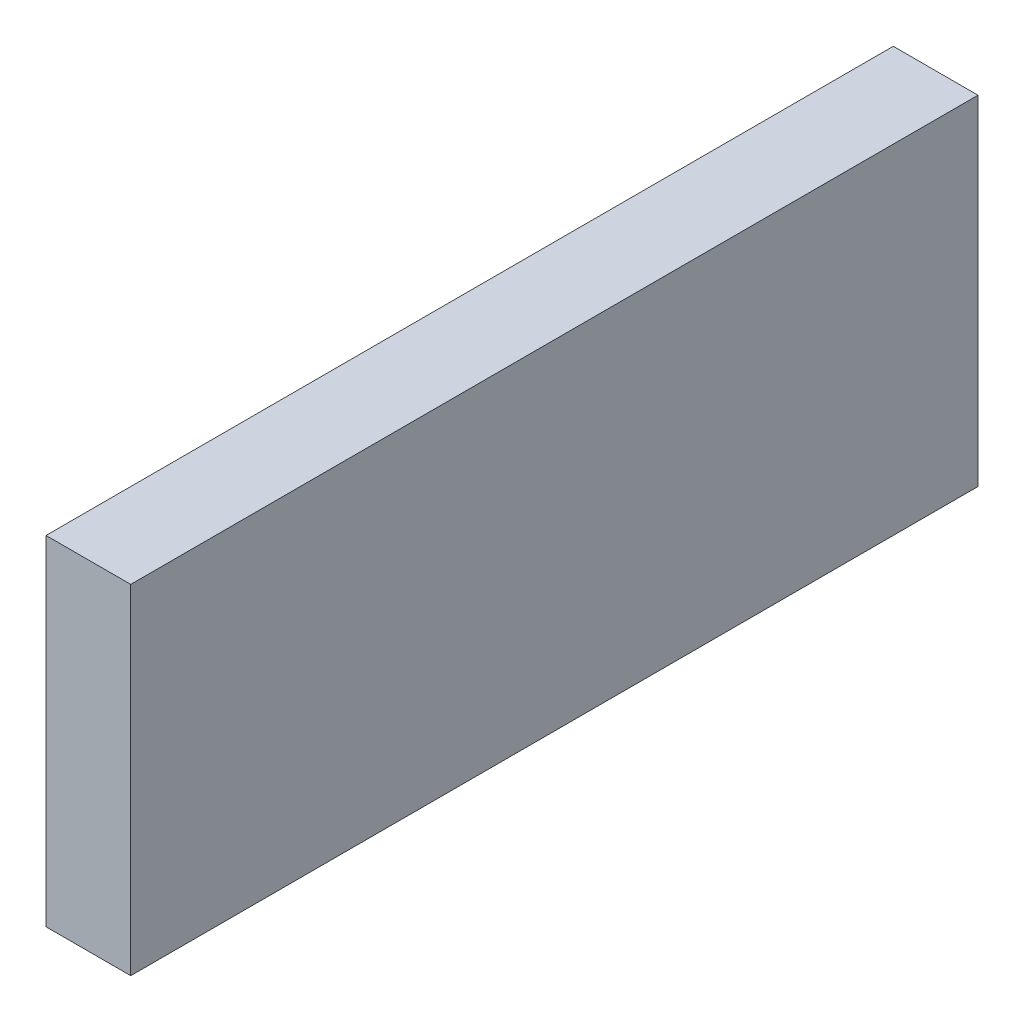
ISO-10303-21;
HEADER;
FILE_DESCRIPTION(('STEP AP214'),'2;1');
FILE_NAME('part.step','',(''),(''),'','','');
FILE_SCHEMA(('AUTOMOTIVE_DESIGN { 1 0 10303 214 1 1 1 1 }'));
ENDSEC;
DATA;
#1=APPLICATION_CONTEXT('core data for automotive mechanical design processes');
#2=APPLICATION_PROTOCOL_DEFINITION('international standard','automotive_design',2000,#1);
#3=PRODUCT_CONTEXT('',#1,'mechanical');
#4=PRODUCT('Part','Part','',(#3));
#5=PRODUCT_RELATED_PRODUCT_CATEGORY('part','',(#4));
#6=PRODUCT_DEFINITION_FORMATION('','',#4);
#7=PRODUCT_DEFINITION_CONTEXT('part definition',#1,'design');
#8=PRODUCT_DEFINITION('design','',#6,#7);
#9=PRODUCT_DEFINITION_SHAPE('','',#8);
#10=(LENGTH_UNIT() NAMED_UNIT(*) SI_UNIT(.MILLI.,.METRE.));
#11=(NAMED_UNIT(*) PLANE_ANGLE_UNIT() SI_UNIT($,.RADIAN.));
#12=(NAMED_UNIT(*) SI_UNIT($,.STERADIAN.) SOLID_ANGLE_UNIT());
#13=UNCERTAINTY_MEASURE_WITH_UNIT(LENGTH_MEASURE(1.E-05),#10,'distance_accuracy_value','');
#14=(GEOMETRIC_REPRESENTATION_CONTEXT(3) GLOBAL_UNCERTAINTY_ASSIGNED_CONTEXT((#13)) GLOBAL_UNIT_ASSIGNED_CONTEXT((#10,
#11,#12)) REPRESENTATION_CONTEXT('',''));
#15=CARTESIAN_POINT('',(0.,0.,0.));
#16=DIRECTION('',(0.,0.,1.));
#17=DIRECTION('',(1.,0.,0.));
#18=AXIS2_PLACEMENT_3D('',#15,#16,#17);
#19=CARTESIAN_POINT('',(0.,38.1,0.));
#20=DIRECTION('',(1.,0.,0.));
#21=DIRECTION('',(0.,0.,-1.));
#22=AXIS2_PLACEMENT_3D('',#19,#20,#21);
#23=PLANE('',#22);
#24=DIRECTION('',(0.,0.,1.));
#25=VECTOR('',#24,1.);
#26=CARTESIAN_POINT('',(0.,0.,0.));
#27=LINE('',#26,#25);
#28=CARTESIAN_POINT('',(0.,0.,-95.25));
#29=VERTEX_POINT('',#28);
#30=CARTESIAN_POINT('',(0.,0.,0.));
#31=VERTEX_POINT('',#30);
#32=EDGE_CURVE('E95',#29,#31,#27,.T.);
#33=ORIENTED_EDGE('',*,*,#32,.T.);
#34=DIRECTION('',(0.,-1.,0.));
#35=VECTOR('',#34,1.);
#36=CARTESIAN_POINT('',(0.,38.1,0.));
#37=LINE('',#36,#35);
#38=CARTESIAN_POINT('',(0.,38.1,0.));
#39=VERTEX_POINT('',#38);
#40=EDGE_CURVE('E11',#39,#31,#37,.T.);
#41=ORIENTED_EDGE('',*,*,#40,.F.);
#42=DIRECTION('',(0.,0.,1.));
#43=VECTOR('',#42,1.);
#44=CARTESIAN_POINT('',(0.,38.1,0.));
#45=LINE('',#44,#43);
#46=CARTESIAN_POINT('',(0.,38.1,-95.25));
#47=VERTEX_POINT('',#46);
#48=EDGE_CURVE('E83',#47,#39,#45,.T.);
#49=ORIENTED_EDGE('',*,*,#48,.F.);
#50=DIRECTION('',(0.,-1.,0.));
#51=VECTOR('',#50,1.);
#52=CARTESIAN_POINT('',(0.,38.1,-95.25));
#53=LINE('',#52,#51);
#54=EDGE_CURVE('E91',#47,#29,#53,.T.);
#55=ORIENTED_EDGE('',*,*,#54,.T.);
#56=EDGE_LOOP('',(#33,#41,#49,#55));
#57=FACE_BOUND('',#56,.T.);
#58=ADVANCED_FACE('F32',(#57),#23,.F.);
#59=CARTESIAN_POINT('',(0.,38.1,0.));
#60=DIRECTION('',(0.,0.,-1.));
#61=DIRECTION('',(-1.,0.,0.));
#62=AXIS2_PLACEMENT_3D('',#59,#60,#61);
#63=PLANE('',#62);
#64=DIRECTION('',(1.,0.,0.));
#65=VECTOR('',#64,1.);
#66=CARTESIAN_POINT('',(0.,0.,0.));
#67=LINE('',#66,#65);
#68=CARTESIAN_POINT('',(9.525,0.,0.));
#69=VERTEX_POINT('',#68);
#70=EDGE_CURVE('E87',#31,#69,#67,.T.);
#71=ORIENTED_EDGE('',*,*,#70,.T.);
#72=DIRECTION('',(0.,-1.,0.));
#73=VECTOR('',#72,1.);
#74=CARTESIAN_POINT('',(9.525,38.1,0.));
#75=LINE('',#74,#73);
#76=CARTESIAN_POINT('',(9.525,38.1,0.));
#77=VERTEX_POINT('',#76);
#78=EDGE_CURVE('E40',#77,#69,#75,.T.);
#79=ORIENTED_EDGE('',*,*,#78,.F.);
#80=DIRECTION('',(1.,0.,0.));
#81=VECTOR('',#80,1.);
#82=CARTESIAN_POINT('',(0.,38.1,0.));
#83=LINE('',#82,#81);
#84=EDGE_CURVE('E78',#39,#77,#83,.T.);
#85=ORIENTED_EDGE('',*,*,#84,.F.);
#86=ORIENTED_EDGE('',*,*,#40,.T.);
#87=EDGE_LOOP('',(#71,#79,#85,#86));
#88=FACE_BOUND('',#87,.T.);
#89=ADVANCED_FACE('F86',(#88),#63,.F.);
#90=CARTESIAN_POINT('',(9.525,38.1,0.));
#91=DIRECTION('',(-1.,0.,0.));
#92=DIRECTION('',(0.,0.,1.));
#93=AXIS2_PLACEMENT_3D('',#90,#91,#92);
#94=PLANE('',#93);
#95=DIRECTION('',(0.,0.,-1.));
#96=VECTOR('',#95,1.);
#97=CARTESIAN_POINT('',(9.525,0.,0.));
#98=LINE('',#97,#96);
#99=CARTESIAN_POINT('',(9.525,0.,-95.25));
#100=VERTEX_POINT('',#99);
#101=EDGE_CURVE('E65',#69,#100,#98,.T.);
#102=ORIENTED_EDGE('',*,*,#101,.T.);
#103=DIRECTION('',(0.,-1.,0.));
#104=VECTOR('',#103,1.);
#105=CARTESIAN_POINT('',(9.525,38.1,-95.25));
#106=LINE('',#105,#104);
#107=CARTESIAN_POINT('',(9.525,38.1,-95.25));
#108=VERTEX_POINT('',#107);
#109=EDGE_CURVE('E88',#108,#100,#106,.T.);
#110=ORIENTED_EDGE('',*,*,#109,.F.);
#111=DIRECTION('',(0.,0.,-1.));
#112=VECTOR('',#111,1.);
#113=CARTESIAN_POINT('',(9.525,38.1,0.));
#114=LINE('',#113,#112);
#115=EDGE_CURVE('E81',#77,#108,#114,.T.);
#116=ORIENTED_EDGE('',*,*,#115,.F.);
#117=ORIENTED_EDGE('',*,*,#78,.T.);
#118=EDGE_LOOP('',(#102,#110,#116,#117));
#119=FACE_BOUND('',#118,.T.);
#120=ADVANCED_FACE('F89',(#119),#94,.F.);
#121=CARTESIAN_POINT('',(0.,38.1,-95.25));
#122=DIRECTION('',(0.,0.,1.));
#123=DIRECTION('',(1.,0.,0.));
#124=AXIS2_PLACEMENT_3D('',#121,#122,#123);
#125=PLANE('',#124);
#126=DIRECTION('',(-1.,0.,0.));
#127=VECTOR('',#126,1.);
#128=CARTESIAN_POINT('',(0.,0.,-95.25));
#129=LINE('',#128,#127);
#130=EDGE_CURVE('E71',#100,#29,#129,.T.);
#131=ORIENTED_EDGE('',*,*,#130,.T.);
#132=ORIENTED_EDGE('',*,*,#54,.F.);
#133=DIRECTION('',(-1.,0.,0.));
#134=VECTOR('',#133,1.);
#135=CARTESIAN_POINT('',(0.,38.1,-95.25));
#136=LINE('',#135,#134);
#137=EDGE_CURVE('E48',#108,#47,#136,.T.);
#138=ORIENTED_EDGE('',*,*,#137,.F.);
#139=ORIENTED_EDGE('',*,*,#109,.T.);
#140=EDGE_LOOP('',(#131,#132,#138,#139));
#141=FACE_BOUND('',#140,.T.);
#142=ADVANCED_FACE('F102',(#141),#125,.F.);
#143=CARTESIAN_POINT('',(0.,38.1,0.));
#144=DIRECTION('',(0.,-1.,0.));
#145=DIRECTION('',(0.,0.,-1.));
#146=AXIS2_PLACEMENT_3D('',#143,#144,#145);
#147=PLANE('',#146);
#148=ORIENTED_EDGE('',*,*,#48,.T.);
#149=ORIENTED_EDGE('',*,*,#84,.T.);
#150=ORIENTED_EDGE('',*,*,#115,.T.);
#151=ORIENTED_EDGE('',*,*,#137,.T.);
#152=EDGE_LOOP('',(#148,#149,#150,#151));
#153=FACE_BOUND('',#152,.T.);
#154=ADVANCED_FACE('F79',(#153),#147,.F.);
#155=CARTESIAN_POINT('',(0.,0.,0.));
#156=DIRECTION('',(0.,-1.,0.));
#157=DIRECTION('',(0.,0.,-1.));
#158=AXIS2_PLACEMENT_3D('',#155,#156,#157);
#159=PLANE('',#158);
#160=ORIENTED_EDGE('',*,*,#32,.F.);
#161=ORIENTED_EDGE('',*,*,#130,.F.);
#162=ORIENTED_EDGE('',*,*,#101,.F.);
#163=ORIENTED_EDGE('',*,*,#70,.F.);
#164=EDGE_LOOP('',(#160,#161,#162,#163));
#165=FACE_BOUND('',#164,.T.);
#166=ADVANCED_FACE('F105',(#165),#159,.T.);
#167=CLOSED_SHELL('',(#58,#89,#120,#142,#154,#166));
#168=MANIFOLD_SOLID_BREP('B2',#167);
#169=ADVANCED_BREP_SHAPE_REPRESENTATION('',(#18,#168),#14);
#170=SHAPE_DEFINITION_REPRESENTATION(#9,#169);
ENDSEC;
END-ISO-10303-21;
